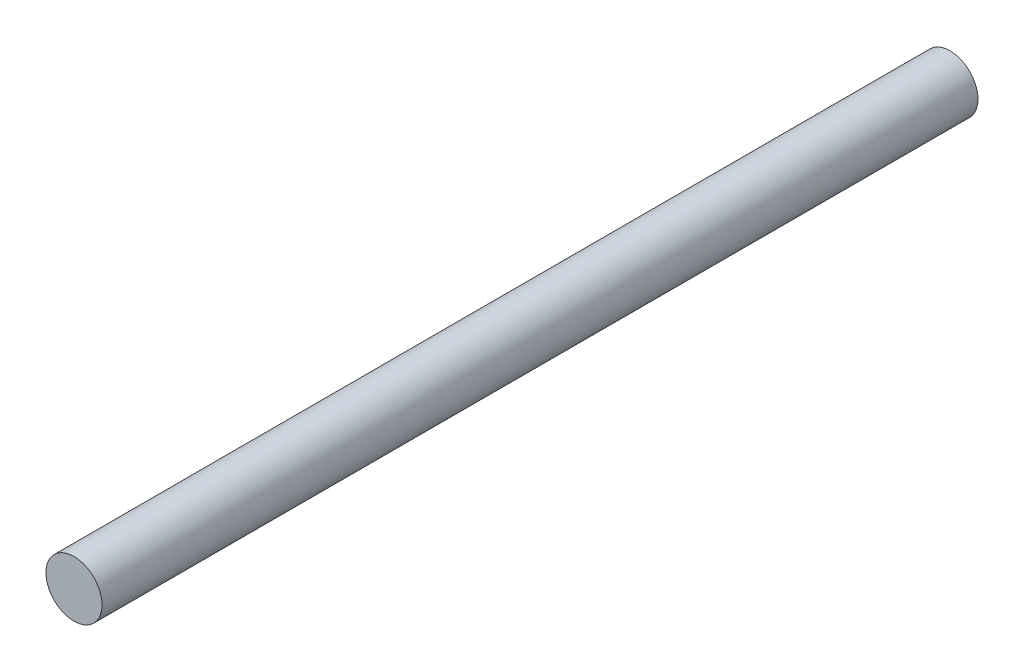
ISO-10303-21;
HEADER;
FILE_DESCRIPTION(('STEP AP214'),'2;1');
FILE_NAME('part.step','',(''),(''),'','','');
FILE_SCHEMA(('AUTOMOTIVE_DESIGN { 1 0 10303 214 1 1 1 1 }'));
ENDSEC;
DATA;
#1=APPLICATION_CONTEXT('core data for automotive mechanical design processes');
#2=APPLICATION_PROTOCOL_DEFINITION('international standard','automotive_design',2000,#1);
#3=PRODUCT_CONTEXT('',#1,'mechanical');
#4=PRODUCT('Part','Part','',(#3));
#5=PRODUCT_RELATED_PRODUCT_CATEGORY('part','',(#4));
#6=PRODUCT_DEFINITION_FORMATION('','',#4);
#7=PRODUCT_DEFINITION_CONTEXT('part definition',#1,'design');
#8=PRODUCT_DEFINITION('design','',#6,#7);
#9=PRODUCT_DEFINITION_SHAPE('','',#8);
#10=(LENGTH_UNIT() NAMED_UNIT(*) SI_UNIT(.MILLI.,.METRE.));
#11=(NAMED_UNIT(*) PLANE_ANGLE_UNIT() SI_UNIT($,.RADIAN.));
#12=(NAMED_UNIT(*) SI_UNIT($,.STERADIAN.) SOLID_ANGLE_UNIT());
#13=UNCERTAINTY_MEASURE_WITH_UNIT(LENGTH_MEASURE(1.E-05),#10,'distance_accuracy_value','');
#14=(GEOMETRIC_REPRESENTATION_CONTEXT(3) GLOBAL_UNCERTAINTY_ASSIGNED_CONTEXT((#13)) GLOBAL_UNIT_ASSIGNED_CONTEXT((#10,
#11,#12)) REPRESENTATION_CONTEXT('',''));
#15=CARTESIAN_POINT('',(0.,0.,0.));
#16=DIRECTION('',(0.,0.,1.));
#17=DIRECTION('',(1.,0.,0.));
#18=AXIS2_PLACEMENT_3D('',#15,#16,#17);
#19=CARTESIAN_POINT('',(0.,0.,250.));
#20=DIRECTION('',(0.,0.,-1.));
#21=DIRECTION('',(-1.,0.,0.));
#22=AXIS2_PLACEMENT_3D('',#19,#20,#21);
#23=CYLINDRICAL_SURFACE('',#22,8.);
#24=CARTESIAN_POINT('',(0.,0.,250.));
#25=DIRECTION('',(0.,0.,1.));
#26=DIRECTION('',(1.,0.,0.));
#27=AXIS2_PLACEMENT_3D('',#24,#25,#26);
#28=CIRCLE('',#27,8.);
#29=CARTESIAN_POINT('',(8.,0.,250.));
#30=VERTEX_POINT('',#29);
#31=EDGE_CURVE('E10',#30,#30,#28,.T.);
#32=ORIENTED_EDGE('',*,*,#31,.F.);
#33=EDGE_LOOP('',(#32));
#34=FACE_BOUND('',#33,.T.);
#35=CARTESIAN_POINT('',(0.,0.,0.));
#36=DIRECTION('',(0.,0.,1.));
#37=DIRECTION('',(1.,0.,0.));
#38=AXIS2_PLACEMENT_3D('',#35,#36,#37);
#39=CIRCLE('',#38,8.);
#40=CARTESIAN_POINT('',(8.,0.,0.));
#41=VERTEX_POINT('',#40);
#42=EDGE_CURVE('E40',#41,#41,#39,.T.);
#43=ORIENTED_EDGE('',*,*,#42,.T.);
#44=EDGE_LOOP('',(#43));
#45=FACE_BOUND('',#44,.T.);
#46=ADVANCED_FACE('F37',(#34,#45),#23,.T.);
#47=CARTESIAN_POINT('',(0.,0.,250.));
#48=DIRECTION('',(0.,0.,1.));
#49=DIRECTION('',(1.,0.,0.));
#50=AXIS2_PLACEMENT_3D('',#47,#48,#49);
#51=PLANE('',#50);
#52=ORIENTED_EDGE('',*,*,#31,.T.);
#53=EDGE_LOOP('',(#52));
#54=FACE_BOUND('',#53,.T.);
#55=ADVANCED_FACE('F54',(#54),#51,.T.);
#56=CARTESIAN_POINT('',(0.,0.,0.));
#57=DIRECTION('',(0.,0.,1.));
#58=DIRECTION('',(1.,0.,0.));
#59=AXIS2_PLACEMENT_3D('',#56,#57,#58);
#60=PLANE('',#59);
#61=ORIENTED_EDGE('',*,*,#42,.F.);
#62=EDGE_LOOP('',(#61));
#63=FACE_BOUND('',#62,.T.);
#64=ADVANCED_FACE('F52',(#63),#60,.F.);
#65=CLOSED_SHELL('',(#46,#55,#64));
#66=MANIFOLD_SOLID_BREP('B2',#65);
#67=ADVANCED_BREP_SHAPE_REPRESENTATION('',(#18,#66),#14);
#68=SHAPE_DEFINITION_REPRESENTATION(#9,#67);
ENDSEC;
END-ISO-10303-21;
